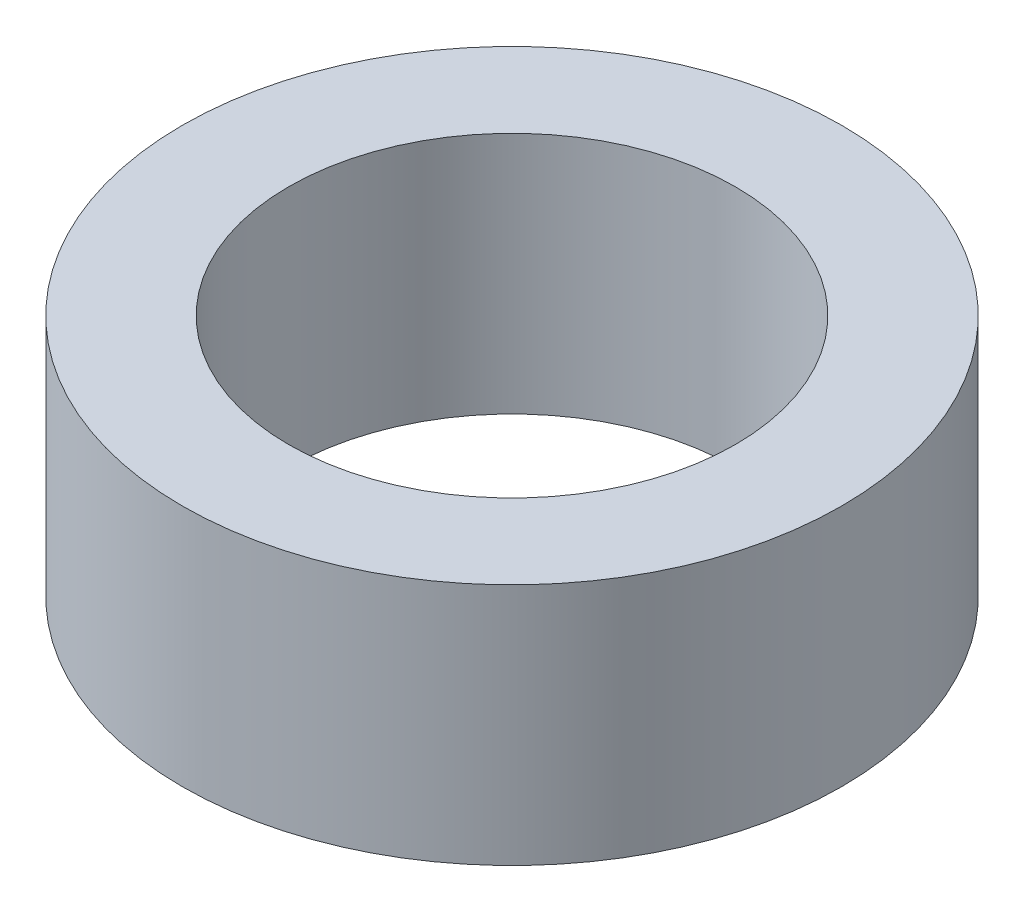
ISO-10303-21;
HEADER;
FILE_DESCRIPTION(('STEP AP214'),'2;1');
FILE_NAME('part.step','',(''),(''),'','','');
FILE_SCHEMA(('AUTOMOTIVE_DESIGN { 1 0 10303 214 1 1 1 1 }'));
ENDSEC;
DATA;
#1=APPLICATION_CONTEXT('core data for automotive mechanical design processes');
#2=APPLICATION_PROTOCOL_DEFINITION('international standard','automotive_design',2000,#1);
#3=PRODUCT_CONTEXT('',#1,'mechanical');
#4=PRODUCT('Part','Part','',(#3));
#5=PRODUCT_RELATED_PRODUCT_CATEGORY('part','',(#4));
#6=PRODUCT_DEFINITION_FORMATION('','',#4);
#7=PRODUCT_DEFINITION_CONTEXT('part definition',#1,'design');
#8=PRODUCT_DEFINITION('design','',#6,#7);
#9=PRODUCT_DEFINITION_SHAPE('','',#8);
#10=(LENGTH_UNIT() NAMED_UNIT(*) SI_UNIT(.MILLI.,.METRE.));
#11=(NAMED_UNIT(*) PLANE_ANGLE_UNIT() SI_UNIT($,.RADIAN.));
#12=(NAMED_UNIT(*) SI_UNIT($,.STERADIAN.) SOLID_ANGLE_UNIT());
#13=UNCERTAINTY_MEASURE_WITH_UNIT(LENGTH_MEASURE(1.E-05),#10,'distance_accuracy_value','');
#14=(GEOMETRIC_REPRESENTATION_CONTEXT(3) GLOBAL_UNCERTAINTY_ASSIGNED_CONTEXT((#13)) GLOBAL_UNIT_ASSIGNED_CONTEXT((#10,
#11,#12)) REPRESENTATION_CONTEXT('',''));
#15=CARTESIAN_POINT('',(0.,0.,0.));
#16=DIRECTION('',(0.,0.,1.));
#17=DIRECTION('',(1.,0.,0.));
#18=AXIS2_PLACEMENT_3D('',#15,#16,#17);
#19=CARTESIAN_POINT('',(0.,4.,0.));
#20=DIRECTION('',(0.,1.,0.));
#21=DIRECTION('',(0.,0.,1.));
#22=AXIS2_PLACEMENT_3D('',#19,#20,#21);
#23=PLANE('',#22);
#24=CARTESIAN_POINT('',(0.,4.,0.));
#25=DIRECTION('',(0.,1.,0.));
#26=DIRECTION('',(0.,0.,1.));
#27=AXIS2_PLACEMENT_3D('',#24,#25,#26);
#28=CIRCLE('',#27,5.425);
#29=CARTESIAN_POINT('',(0.,4.,5.425));
#30=VERTEX_POINT('',#29);
#31=EDGE_CURVE('E10',#30,#30,#28,.T.);
#32=ORIENTED_EDGE('',*,*,#31,.T.);
#33=EDGE_LOOP('',(#32));
#34=FACE_BOUND('',#33,.T.);
#35=CARTESIAN_POINT('',(0.,4.,0.));
#36=DIRECTION('',(0.,1.,0.));
#37=DIRECTION('',(0.,0.,1.));
#38=AXIS2_PLACEMENT_3D('',#35,#36,#37);
#39=CIRCLE('',#38,3.675);
#40=CARTESIAN_POINT('',(0.,4.,3.675));
#41=VERTEX_POINT('',#40);
#42=EDGE_CURVE('E49',#41,#41,#39,.T.);
#43=ORIENTED_EDGE('',*,*,#42,.F.);
#44=EDGE_LOOP('',(#43));
#45=FACE_BOUND('',#44,.T.);
#46=ADVANCED_FACE('F38',(#34,#45),#23,.T.);
#47=CARTESIAN_POINT('',(0.,0.,0.));
#48=DIRECTION('',(0.,1.,0.));
#49=DIRECTION('',(0.,0.,1.));
#50=AXIS2_PLACEMENT_3D('',#47,#48,#49);
#51=PLANE('',#50);
#52=CARTESIAN_POINT('',(0.,0.,0.));
#53=DIRECTION('',(0.,1.,0.));
#54=DIRECTION('',(0.,0.,1.));
#55=AXIS2_PLACEMENT_3D('',#52,#53,#54);
#56=CIRCLE('',#55,5.425);
#57=CARTESIAN_POINT('',(0.,0.,5.425));
#58=VERTEX_POINT('',#57);
#59=EDGE_CURVE('E42',#58,#58,#56,.T.);
#60=ORIENTED_EDGE('',*,*,#59,.F.);
#61=EDGE_LOOP('',(#60));
#62=FACE_BOUND('',#61,.T.);
#63=CARTESIAN_POINT('',(0.,0.,0.));
#64=DIRECTION('',(0.,1.,0.));
#65=DIRECTION('',(0.,0.,1.));
#66=AXIS2_PLACEMENT_3D('',#63,#64,#65);
#67=CIRCLE('',#66,3.675);
#68=CARTESIAN_POINT('',(0.,0.,3.675));
#69=VERTEX_POINT('',#68);
#70=EDGE_CURVE('E51',#69,#69,#67,.T.);
#71=ORIENTED_EDGE('',*,*,#70,.T.);
#72=EDGE_LOOP('',(#71));
#73=FACE_BOUND('',#72,.T.);
#74=ADVANCED_FACE('F61',(#62,#73),#51,.F.);
#75=CARTESIAN_POINT('',(0.,4.,0.));
#76=DIRECTION('',(0.,-1.,0.));
#77=DIRECTION('',(0.,0.,-1.));
#78=AXIS2_PLACEMENT_3D('',#75,#76,#77);
#79=CYLINDRICAL_SURFACE('',#78,5.425);
#80=ORIENTED_EDGE('',*,*,#31,.F.);
#81=EDGE_LOOP('',(#80));
#82=FACE_BOUND('',#81,.T.);
#83=ORIENTED_EDGE('',*,*,#59,.T.);
#84=EDGE_LOOP('',(#83));
#85=FACE_BOUND('',#84,.T.);
#86=ADVANCED_FACE('F40',(#82,#85),#79,.T.);
#87=CARTESIAN_POINT('',(0.,4.,0.));
#88=DIRECTION('',(0.,-1.,0.));
#89=DIRECTION('',(0.,0.,-1.));
#90=AXIS2_PLACEMENT_3D('',#87,#88,#89);
#91=CYLINDRICAL_SURFACE('',#90,3.675);
#92=ORIENTED_EDGE('',*,*,#42,.T.);
#93=EDGE_LOOP('',(#92));
#94=FACE_BOUND('',#93,.T.);
#95=ORIENTED_EDGE('',*,*,#70,.F.);
#96=EDGE_LOOP('',(#95));
#97=FACE_BOUND('',#96,.T.);
#98=ADVANCED_FACE('F57',(#94,#97),#91,.F.);
#99=CLOSED_SHELL('',(#46,#74,#86,#98));
#100=MANIFOLD_SOLID_BREP('B2',#99);
#101=ADVANCED_BREP_SHAPE_REPRESENTATION('',(#18,#100),#14);
#102=SHAPE_DEFINITION_REPRESENTATION(#9,#101);
ENDSEC;
END-ISO-10303-21;
